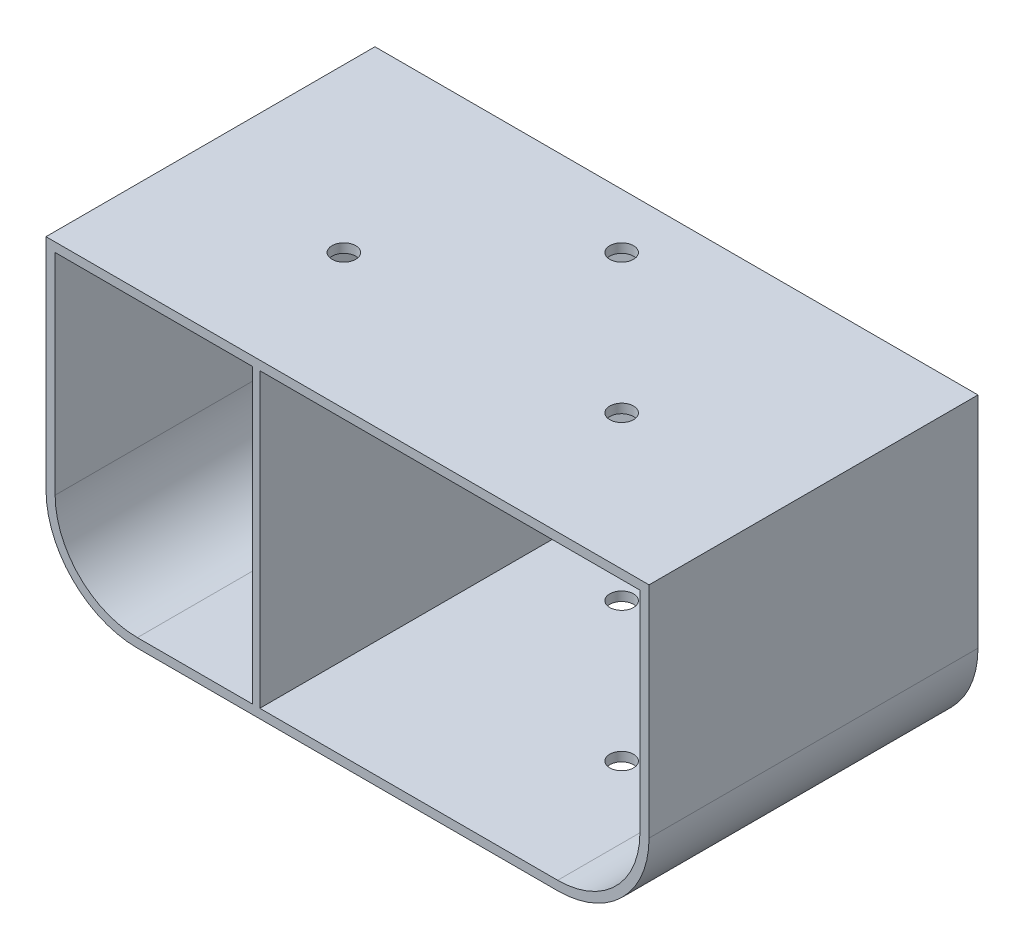
ISO-10303-21;
HEADER;
FILE_DESCRIPTION(('STEP AP214'),'2;1');
FILE_NAME('part.step','',(''),(''),'','','');
FILE_SCHEMA(('AUTOMOTIVE_DESIGN { 1 0 10303 214 1 1 1 1 }'));
ENDSEC;
DATA;
#1=APPLICATION_CONTEXT('core data for automotive mechanical design processes');
#2=APPLICATION_PROTOCOL_DEFINITION('international standard','automotive_design',2000,#1);
#3=PRODUCT_CONTEXT('',#1,'mechanical');
#4=PRODUCT('Part','Part','',(#3));
#5=PRODUCT_RELATED_PRODUCT_CATEGORY('part','',(#4));
#6=PRODUCT_DEFINITION_FORMATION('','',#4);
#7=PRODUCT_DEFINITION_CONTEXT('part definition',#1,'design');
#8=PRODUCT_DEFINITION('design','',#6,#7);
#9=PRODUCT_DEFINITION_SHAPE('','',#8);
#10=(LENGTH_UNIT() NAMED_UNIT(*) SI_UNIT(.MILLI.,.METRE.));
#11=(NAMED_UNIT(*) PLANE_ANGLE_UNIT() SI_UNIT($,.RADIAN.));
#12=(NAMED_UNIT(*) SI_UNIT($,.STERADIAN.) SOLID_ANGLE_UNIT());
#13=UNCERTAINTY_MEASURE_WITH_UNIT(LENGTH_MEASURE(1.E-05),#10,'distance_accuracy_value','');
#14=(GEOMETRIC_REPRESENTATION_CONTEXT(3) GLOBAL_UNCERTAINTY_ASSIGNED_CONTEXT((#13)) GLOBAL_UNIT_ASSIGNED_CONTEXT((#10,
#11,#12)) REPRESENTATION_CONTEXT('',''));
#15=CARTESIAN_POINT('',(0.,0.,0.));
#16=DIRECTION('',(0.,0.,1.));
#17=DIRECTION('',(1.,0.,0.));
#18=AXIS2_PLACEMENT_3D('',#15,#16,#17);
#19=CARTESIAN_POINT('',(-82.5000000000001,42.5,90.));
#20=DIRECTION('',(1.,0.,0.));
#21=DIRECTION('',(0.,0.,-1.));
#22=AXIS2_PLACEMENT_3D('',#19,#20,#21);
#23=PLANE('',#22);
#24=DIRECTION('',(0.,-1.,0.));
#25=VECTOR('',#24,1.);
#26=CARTESIAN_POINT('',(-82.5000000000001,42.5,0.));
#27=LINE('',#26,#25);
#28=CARTESIAN_POINT('',(-82.5000000000001,42.5,0.));
#29=VERTEX_POINT('',#28);
#30=CARTESIAN_POINT('',(-82.5000000000001,-17.4999999999998,0.));
#31=VERTEX_POINT('',#30);
#32=EDGE_CURVE('E224',#29,#31,#27,.T.);
#33=ORIENTED_EDGE('',*,*,#32,.T.);
#34=DIRECTION('',(0.,0.,-1.));
#35=VECTOR('',#34,1.);
#36=CARTESIAN_POINT('',(-82.5000000000001,-17.4999999999998,90.));
#37=LINE('',#36,#35);
#38=CARTESIAN_POINT('',(-82.5000000000001,-17.4999999999998,90.));
#39=VERTEX_POINT('',#38);
#40=EDGE_CURVE('E11',#39,#31,#37,.T.);
#41=ORIENTED_EDGE('',*,*,#40,.F.);
#42=DIRECTION('',(0.,-1.,0.));
#43=VECTOR('',#42,1.);
#44=CARTESIAN_POINT('',(-82.5000000000001,42.5,90.));
#45=LINE('',#44,#43);
#46=CARTESIAN_POINT('',(-82.5000000000001,42.5,90.));
#47=VERTEX_POINT('',#46);
#48=EDGE_CURVE('E232',#47,#39,#45,.T.);
#49=ORIENTED_EDGE('',*,*,#48,.F.);
#50=DIRECTION('',(0.,0.,-1.));
#51=VECTOR('',#50,1.);
#52=CARTESIAN_POINT('',(-82.5000000000001,42.5,90.));
#53=LINE('',#52,#51);
#54=EDGE_CURVE('E246',#47,#29,#53,.T.);
#55=ORIENTED_EDGE('',*,*,#54,.T.);
#56=EDGE_LOOP('',(#33,#41,#49,#55));
#57=FACE_BOUND('',#56,.T.);
#58=ADVANCED_FACE('F33',(#57),#23,.F.);
#59=CARTESIAN_POINT('',(-57.5000000000001,-17.5,90.));
#60=DIRECTION('',(0.,0.,-1.));
#61=DIRECTION('',(-1.,0.,0.));
#62=AXIS2_PLACEMENT_3D('',#59,#60,#61);
#63=CYLINDRICAL_SURFACE('',#62,25.);
#64=CARTESIAN_POINT('',(-57.5000000000001,-17.5,0.));
#65=DIRECTION('',(0.,0.,1.));
#66=DIRECTION('',(1.,0.,0.));
#67=AXIS2_PLACEMENT_3D('',#64,#65,#66);
#68=CIRCLE('',#67,25.);
#69=CARTESIAN_POINT('',(-57.4999999999999,-42.5,0.));
#70=VERTEX_POINT('',#69);
#71=EDGE_CURVE('E249',#31,#70,#68,.T.);
#72=ORIENTED_EDGE('',*,*,#71,.T.);
#73=DIRECTION('',(0.,0.,-1.));
#74=VECTOR('',#73,1.);
#75=CARTESIAN_POINT('',(-57.4999999999999,-42.5,90.));
#76=LINE('',#75,#74);
#77=CARTESIAN_POINT('',(-57.4999999999999,-42.5,90.));
#78=VERTEX_POINT('',#77);
#79=EDGE_CURVE('E41',#78,#70,#76,.T.);
#80=ORIENTED_EDGE('',*,*,#79,.F.);
#81=CARTESIAN_POINT('',(-57.5000000000001,-17.5,90.));
#82=DIRECTION('',(0.,0.,1.));
#83=DIRECTION('',(1.,0.,0.));
#84=AXIS2_PLACEMENT_3D('',#81,#82,#83);
#85=CIRCLE('',#84,25.);
#86=EDGE_CURVE('E235',#39,#78,#85,.T.);
#87=ORIENTED_EDGE('',*,*,#86,.F.);
#88=ORIENTED_EDGE('',*,*,#40,.T.);
#89=EDGE_LOOP('',(#72,#80,#87,#88));
#90=FACE_BOUND('',#89,.T.);
#91=ADVANCED_FACE('F332',(#90),#63,.T.);
#92=CARTESIAN_POINT('',(-57.4999999999999,-42.5,90.));
#93=DIRECTION('',(0.,1.,0.));
#94=DIRECTION('',(0.,0.,1.));
#95=AXIS2_PLACEMENT_3D('',#92,#93,#94);
#96=PLANE('',#95);
#97=CARTESIAN_POINT('',(0.,-42.5,15.));
#98=DIRECTION('',(0.,1.,0.));
#99=DIRECTION('',(0.,0.,1.));
#100=AXIS2_PLACEMENT_3D('',#97,#98,#99);
#101=CIRCLE('',#100,3.24999999999998);
#102=CARTESIAN_POINT('',(0.,-42.5,18.25));
#103=VERTEX_POINT('',#102);
#104=EDGE_CURVE('E298',#103,#103,#101,.T.);
#105=ORIENTED_EDGE('',*,*,#104,.T.);
#106=EDGE_LOOP('',(#105));
#107=FACE_BOUND('',#106,.T.);
#108=CARTESIAN_POINT('',(38.,-42.5,53.));
#109=DIRECTION('',(0.,1.,0.));
#110=DIRECTION('',(0.,0.,1.));
#111=AXIS2_PLACEMENT_3D('',#108,#109,#110);
#112=CIRCLE('',#111,3.24999999999998);
#113=CARTESIAN_POINT('',(38.,-42.5,56.25));
#114=VERTEX_POINT('',#113);
#115=EDGE_CURVE('E289',#114,#114,#112,.T.);
#116=ORIENTED_EDGE('',*,*,#115,.T.);
#117=EDGE_LOOP('',(#116));
#118=FACE_BOUND('',#117,.T.);
#119=CARTESIAN_POINT('',(-38.,-42.5,53.));
#120=DIRECTION('',(0.,1.,0.));
#121=DIRECTION('',(0.,0.,1.));
#122=AXIS2_PLACEMENT_3D('',#119,#120,#121);
#123=CIRCLE('',#122,3.24999999999998);
#124=CARTESIAN_POINT('',(-38.,-42.5,56.25));
#125=VERTEX_POINT('',#124);
#126=EDGE_CURVE('E272',#125,#125,#123,.T.);
#127=ORIENTED_EDGE('',*,*,#126,.T.);
#128=EDGE_LOOP('',(#127));
#129=FACE_BOUND('',#128,.T.);
#130=DIRECTION('',(1.,0.,0.));
#131=VECTOR('',#130,1.);
#132=CARTESIAN_POINT('',(-57.4999999999999,-42.5,0.));
#133=LINE('',#132,#131);
#134=CARTESIAN_POINT('',(57.4999999999998,-42.5,0.));
#135=VERTEX_POINT('',#134);
#136=EDGE_CURVE('E251',#70,#135,#133,.T.);
#137=ORIENTED_EDGE('',*,*,#136,.T.);
#138=DIRECTION('',(0.,0.,-1.));
#139=VECTOR('',#138,1.);
#140=CARTESIAN_POINT('',(57.4999999999998,-42.5,90.));
#141=LINE('',#140,#139);
#142=CARTESIAN_POINT('',(57.4999999999998,-42.5,90.));
#143=VERTEX_POINT('',#142);
#144=EDGE_CURVE('E266',#143,#135,#141,.T.);
#145=ORIENTED_EDGE('',*,*,#144,.F.);
#146=DIRECTION('',(1.,0.,0.));
#147=VECTOR('',#146,1.);
#148=CARTESIAN_POINT('',(-57.4999999999999,-42.5,90.));
#149=LINE('',#148,#147);
#150=EDGE_CURVE('E238',#78,#143,#149,.T.);
#151=ORIENTED_EDGE('',*,*,#150,.F.);
#152=ORIENTED_EDGE('',*,*,#79,.T.);
#153=EDGE_LOOP('',(#137,#145,#151,#152));
#154=FACE_BOUND('',#153,.T.);
#155=ADVANCED_FACE('F343',(#107,#118,#129,#154),#96,.F.);
#156=CARTESIAN_POINT('',(57.5,-17.5,90.));
#157=DIRECTION('',(0.,0.,-1.));
#158=DIRECTION('',(-1.,0.,0.));
#159=AXIS2_PLACEMENT_3D('',#156,#157,#158);
#160=CYLINDRICAL_SURFACE('',#159,25.);
#161=CARTESIAN_POINT('',(57.5,-17.5,0.));
#162=DIRECTION('',(0.,0.,1.));
#163=DIRECTION('',(1.,0.,0.));
#164=AXIS2_PLACEMENT_3D('',#161,#162,#163);
#165=CIRCLE('',#164,25.);
#166=CARTESIAN_POINT('',(82.4999999999999,-17.4999999999998,0.));
#167=VERTEX_POINT('',#166);
#168=EDGE_CURVE('E253',#135,#167,#165,.T.);
#169=ORIENTED_EDGE('',*,*,#168,.T.);
#170=DIRECTION('',(0.,0.,-1.));
#171=VECTOR('',#170,1.);
#172=CARTESIAN_POINT('',(82.4999999999999,-17.4999999999998,90.));
#173=LINE('',#172,#171);
#174=CARTESIAN_POINT('',(82.4999999999999,-17.4999999999998,90.));
#175=VERTEX_POINT('',#174);
#176=EDGE_CURVE('E263',#175,#167,#173,.T.);
#177=ORIENTED_EDGE('',*,*,#176,.F.);
#178=CARTESIAN_POINT('',(57.5,-17.5,90.));
#179=DIRECTION('',(0.,0.,1.));
#180=DIRECTION('',(1.,0.,0.));
#181=AXIS2_PLACEMENT_3D('',#178,#179,#180);
#182=CIRCLE('',#181,25.);
#183=EDGE_CURVE('E240',#143,#175,#182,.T.);
#184=ORIENTED_EDGE('',*,*,#183,.F.);
#185=ORIENTED_EDGE('',*,*,#144,.T.);
#186=EDGE_LOOP('',(#169,#177,#184,#185));
#187=FACE_BOUND('',#186,.T.);
#188=ADVANCED_FACE('F340',(#187),#160,.T.);
#189=CARTESIAN_POINT('',(82.4999999999999,42.5,90.));
#190=DIRECTION('',(-1.,0.,0.));
#191=DIRECTION('',(0.,0.,1.));
#192=AXIS2_PLACEMENT_3D('',#189,#190,#191);
#193=PLANE('',#192);
#194=DIRECTION('',(0.,1.,0.));
#195=VECTOR('',#194,1.);
#196=CARTESIAN_POINT('',(82.4999999999999,42.5,0.));
#197=LINE('',#196,#195);
#198=CARTESIAN_POINT('',(82.4999999999999,42.5,0.));
#199=VERTEX_POINT('',#198);
#200=EDGE_CURVE('E255',#167,#199,#197,.T.);
#201=ORIENTED_EDGE('',*,*,#200,.T.);
#202=DIRECTION('',(0.,0.,-1.));
#203=VECTOR('',#202,1.);
#204=CARTESIAN_POINT('',(82.4999999999999,42.5,90.));
#205=LINE('',#204,#203);
#206=CARTESIAN_POINT('',(82.4999999999999,42.5,90.));
#207=VERTEX_POINT('',#206);
#208=EDGE_CURVE('E260',#207,#199,#205,.T.);
#209=ORIENTED_EDGE('',*,*,#208,.F.);
#210=DIRECTION('',(0.,1.,0.));
#211=VECTOR('',#210,1.);
#212=CARTESIAN_POINT('',(82.4999999999999,42.5,90.));
#213=LINE('',#212,#211);
#214=EDGE_CURVE('E242',#175,#207,#213,.T.);
#215=ORIENTED_EDGE('',*,*,#214,.F.);
#216=ORIENTED_EDGE('',*,*,#176,.T.);
#217=EDGE_LOOP('',(#201,#209,#215,#216));
#218=FACE_BOUND('',#217,.T.);
#219=ADVANCED_FACE('F311',(#218),#193,.F.);
#220=CARTESIAN_POINT('',(-82.5000000000001,42.5,90.));
#221=DIRECTION('',(0.,-1.,0.));
#222=DIRECTION('',(0.,0.,-1.));
#223=AXIS2_PLACEMENT_3D('',#220,#221,#222);
#224=PLANE('',#223);
#225=CARTESIAN_POINT('',(0.,42.5,15.));
#226=DIRECTION('',(0.,1.,0.));
#227=DIRECTION('',(0.,0.,1.));
#228=AXIS2_PLACEMENT_3D('',#225,#226,#227);
#229=CIRCLE('',#228,3.24999999999999);
#230=CARTESIAN_POINT('',(0.,42.5,18.25));
#231=VERTEX_POINT('',#230);
#232=EDGE_CURVE('E301',#231,#231,#229,.T.);
#233=ORIENTED_EDGE('',*,*,#232,.F.);
#234=EDGE_LOOP('',(#233));
#235=FACE_BOUND('',#234,.T.);
#236=CARTESIAN_POINT('',(38.,42.5,53.));
#237=DIRECTION('',(0.,1.,0.));
#238=DIRECTION('',(0.,0.,1.));
#239=AXIS2_PLACEMENT_3D('',#236,#237,#238);
#240=CIRCLE('',#239,3.24999999999999);
#241=CARTESIAN_POINT('',(38.,42.5,56.25));
#242=VERTEX_POINT('',#241);
#243=EDGE_CURVE('E292',#242,#242,#240,.T.);
#244=ORIENTED_EDGE('',*,*,#243,.F.);
#245=EDGE_LOOP('',(#244));
#246=FACE_BOUND('',#245,.T.);
#247=CARTESIAN_POINT('',(-38.,42.5,53.));
#248=DIRECTION('',(0.,1.,0.));
#249=DIRECTION('',(0.,0.,1.));
#250=AXIS2_PLACEMENT_3D('',#247,#248,#249);
#251=CIRCLE('',#250,3.24999999999999);
#252=CARTESIAN_POINT('',(-38.,42.5,56.25));
#253=VERTEX_POINT('',#252);
#254=EDGE_CURVE('E277',#253,#253,#251,.T.);
#255=ORIENTED_EDGE('',*,*,#254,.F.);
#256=EDGE_LOOP('',(#255));
#257=FACE_BOUND('',#256,.T.);
#258=DIRECTION('',(-1.,0.,0.));
#259=VECTOR('',#258,1.);
#260=CARTESIAN_POINT('',(-82.5000000000001,42.5,0.));
#261=LINE('',#260,#259);
#262=EDGE_CURVE('E236',#199,#29,#261,.T.);
#263=ORIENTED_EDGE('',*,*,#262,.T.);
#264=ORIENTED_EDGE('',*,*,#54,.F.);
#265=DIRECTION('',(-1.,0.,0.));
#266=VECTOR('',#265,1.);
#267=CARTESIAN_POINT('',(-82.5000000000001,42.5,90.));
#268=LINE('',#267,#266);
#269=EDGE_CURVE('E244',#207,#47,#268,.T.);
#270=ORIENTED_EDGE('',*,*,#269,.F.);
#271=ORIENTED_EDGE('',*,*,#208,.T.);
#272=EDGE_LOOP('',(#263,#264,#270,#271));
#273=FACE_BOUND('',#272,.T.);
#274=ADVANCED_FACE('F307',(#235,#246,#257,#273),#224,.F.);
#275=CARTESIAN_POINT('',(-57.5000000000001,-17.5,90.));
#276=DIRECTION('',(0.,0.,1.));
#277=DIRECTION('',(1.,0.,0.));
#278=AXIS2_PLACEMENT_3D('',#275,#276,#277);
#279=PLANE('',#278);
#280=DIRECTION('',(0.,-1.,0.));
#281=VECTOR('',#280,1.);
#282=CARTESIAN_POINT('',(-80.0000000000001,0.,90.));
#283=LINE('',#282,#281);
#284=CARTESIAN_POINT('',(-80.0000000000001,40.,90.));
#285=VERTEX_POINT('',#284);
#286=CARTESIAN_POINT('',(-80.0000000000001,-17.4999999999998,90.));
#287=VERTEX_POINT('',#286);
#288=EDGE_CURVE('E49',#285,#287,#283,.T.);
#289=ORIENTED_EDGE('',*,*,#288,.F.);
#290=DIRECTION('',(1.,0.,0.));
#291=VECTOR('',#290,1.);
#292=CARTESIAN_POINT('',(0.,40.,90.));
#293=LINE('',#292,#291);
#294=CARTESIAN_POINT('',(-26.0000000000001,40.,90.));
#295=VERTEX_POINT('',#294);
#296=EDGE_CURVE('E167',#285,#295,#293,.T.);
#297=ORIENTED_EDGE('',*,*,#296,.T.);
#298=DIRECTION('',(0.,1.,0.));
#299=VECTOR('',#298,1.);
#300=CARTESIAN_POINT('',(-26.0000000000001,0.,90.));
#301=LINE('',#300,#299);
#302=CARTESIAN_POINT('',(-26.0000000000001,-40.,90.));
#303=VERTEX_POINT('',#302);
#304=EDGE_CURVE('E170',#303,#295,#301,.T.);
#305=ORIENTED_EDGE('',*,*,#304,.F.);
#306=DIRECTION('',(1.,0.,0.));
#307=VECTOR('',#306,1.);
#308=CARTESIAN_POINT('',(0.,-40.,90.));
#309=LINE('',#308,#307);
#310=CARTESIAN_POINT('',(-57.4999999999999,-40.,90.));
#311=VERTEX_POINT('',#310);
#312=EDGE_CURVE('E183',#311,#303,#309,.T.);
#313=ORIENTED_EDGE('',*,*,#312,.F.);
#314=CARTESIAN_POINT('',(-57.5000000000001,-17.5,90.));
#315=DIRECTION('',(0.,0.,1.));
#316=DIRECTION('',(1.,0.,0.));
#317=AXIS2_PLACEMENT_3D('',#314,#315,#316);
#318=CIRCLE('',#317,22.5);
#319=EDGE_CURVE('E181',#287,#311,#318,.T.);
#320=ORIENTED_EDGE('',*,*,#319,.F.);
#321=EDGE_LOOP('',(#289,#297,#305,#313,#320));
#322=FACE_BOUND('',#321,.T.);
#323=DIRECTION('',(1.,0.,0.));
#324=VECTOR('',#323,1.);
#325=CARTESIAN_POINT('',(0.,-40.,90.));
#326=LINE('',#325,#324);
#327=CARTESIAN_POINT('',(-24.,-40.,90.));
#328=VERTEX_POINT('',#327);
#329=CARTESIAN_POINT('',(57.4999999999998,-40.,90.));
#330=VERTEX_POINT('',#329);
#331=EDGE_CURVE('E57',#328,#330,#326,.T.);
#332=ORIENTED_EDGE('',*,*,#331,.F.);
#333=DIRECTION('',(0.,-1.,0.));
#334=VECTOR('',#333,1.);
#335=CARTESIAN_POINT('',(-24.,0.,90.));
#336=LINE('',#335,#334);
#337=CARTESIAN_POINT('',(-24.,40.,90.));
#338=VERTEX_POINT('',#337);
#339=EDGE_CURVE('E199',#338,#328,#336,.T.);
#340=ORIENTED_EDGE('',*,*,#339,.F.);
#341=DIRECTION('',(1.,0.,0.));
#342=VECTOR('',#341,1.);
#343=CARTESIAN_POINT('',(0.,40.,90.));
#344=LINE('',#343,#342);
#345=CARTESIAN_POINT('',(79.9999999999999,40.,90.));
#346=VERTEX_POINT('',#345);
#347=EDGE_CURVE('E217',#338,#346,#344,.T.);
#348=ORIENTED_EDGE('',*,*,#347,.T.);
#349=DIRECTION('',(0.,-1.,0.));
#350=VECTOR('',#349,1.);
#351=CARTESIAN_POINT('',(79.9999999999999,0.,90.));
#352=LINE('',#351,#350);
#353=CARTESIAN_POINT('',(79.9999999999999,-17.4999999999998,90.));
#354=VERTEX_POINT('',#353);
#355=EDGE_CURVE('E214',#346,#354,#352,.T.);
#356=ORIENTED_EDGE('',*,*,#355,.T.);
#357=CARTESIAN_POINT('',(57.5,-17.5,90.));
#358=DIRECTION('',(0.,0.,1.));
#359=DIRECTION('',(1.,0.,0.));
#360=AXIS2_PLACEMENT_3D('',#357,#358,#359);
#361=CIRCLE('',#360,22.5);
#362=EDGE_CURVE('E211',#330,#354,#361,.T.);
#363=ORIENTED_EDGE('',*,*,#362,.F.);
#364=EDGE_LOOP('',(#332,#340,#348,#356,#363));
#365=FACE_BOUND('',#364,.T.);
#366=ORIENTED_EDGE('',*,*,#48,.T.);
#367=ORIENTED_EDGE('',*,*,#86,.T.);
#368=ORIENTED_EDGE('',*,*,#150,.T.);
#369=ORIENTED_EDGE('',*,*,#183,.T.);
#370=ORIENTED_EDGE('',*,*,#214,.T.);
#371=ORIENTED_EDGE('',*,*,#269,.T.);
#372=EDGE_LOOP('',(#366,#367,#368,#369,#370,#371));
#373=FACE_BOUND('',#372,.T.);
#374=ADVANCED_FACE('F310',(#322,#365,#373),#279,.T.);
#375=CARTESIAN_POINT('',(-57.5000000000001,-17.5,0.));
#376=DIRECTION('',(0.,0.,1.));
#377=DIRECTION('',(1.,0.,0.));
#378=AXIS2_PLACEMENT_3D('',#375,#376,#377);
#379=PLANE('',#378);
#380=ORIENTED_EDGE('',*,*,#32,.F.);
#381=ORIENTED_EDGE('',*,*,#262,.F.);
#382=ORIENTED_EDGE('',*,*,#200,.F.);
#383=ORIENTED_EDGE('',*,*,#168,.F.);
#384=ORIENTED_EDGE('',*,*,#136,.F.);
#385=ORIENTED_EDGE('',*,*,#71,.F.);
#386=EDGE_LOOP('',(#380,#381,#382,#383,#384,#385));
#387=FACE_BOUND('',#386,.T.);
#388=ADVANCED_FACE('F327',(#387),#379,.F.);
#389=CARTESIAN_POINT('',(0.,-40.,3.));
#390=DIRECTION('',(0.,-1.,0.));
#391=DIRECTION('',(1.,0.,0.));
#392=AXIS2_PLACEMENT_3D('',#389,#390,#391);
#393=PLANE('',#392);
#394=CARTESIAN_POINT('',(0.,-40.,15.));
#395=DIRECTION('',(0.,-1.,0.));
#396=DIRECTION('',(1.,0.,0.));
#397=AXIS2_PLACEMENT_3D('',#394,#395,#396);
#398=CIRCLE('',#397,3.24999999999998);
#399=CARTESIAN_POINT('',(3.24999999999999,-40.,15.));
#400=VERTEX_POINT('',#399);
#401=EDGE_CURVE('E295',#400,#400,#398,.T.);
#402=ORIENTED_EDGE('',*,*,#401,.T.);
#403=EDGE_LOOP('',(#402));
#404=FACE_BOUND('',#403,.T.);
#405=CARTESIAN_POINT('',(38.,-40.,53.));
#406=DIRECTION('',(0.,-1.,0.));
#407=DIRECTION('',(1.,0.,0.));
#408=AXIS2_PLACEMENT_3D('',#405,#406,#407);
#409=CIRCLE('',#408,3.24999999999999);
#410=CARTESIAN_POINT('',(41.25,-40.,53.));
#411=VERTEX_POINT('',#410);
#412=EDGE_CURVE('E281',#411,#411,#409,.T.);
#413=ORIENTED_EDGE('',*,*,#412,.T.);
#414=EDGE_LOOP('',(#413));
#415=FACE_BOUND('',#414,.T.);
#416=ORIENTED_EDGE('',*,*,#331,.T.);
#417=DIRECTION('',(0.,0.,1.));
#418=VECTOR('',#417,1.);
#419=CARTESIAN_POINT('',(57.4999999999998,-40.,3.));
#420=LINE('',#419,#418);
#421=CARTESIAN_POINT('',(57.4999999999998,-40.,3.));
#422=VERTEX_POINT('',#421);
#423=EDGE_CURVE('E209',#422,#330,#420,.T.);
#424=ORIENTED_EDGE('',*,*,#423,.F.);
#425=DIRECTION('',(1.,0.,0.));
#426=VECTOR('',#425,1.);
#427=CARTESIAN_POINT('',(0.,-40.,3.));
#428=LINE('',#427,#426);
#429=CARTESIAN_POINT('',(-24.,-40.,3.));
#430=VERTEX_POINT('',#429);
#431=EDGE_CURVE('E195',#430,#422,#428,.T.);
#432=ORIENTED_EDGE('',*,*,#431,.F.);
#433=DIRECTION('',(0.,0.,1.));
#434=VECTOR('',#433,1.);
#435=CARTESIAN_POINT('',(-24.,-40.,3.));
#436=LINE('',#435,#434);
#437=EDGE_CURVE('E222',#430,#328,#436,.T.);
#438=ORIENTED_EDGE('',*,*,#437,.T.);
#439=EDGE_LOOP('',(#416,#424,#432,#438));
#440=FACE_BOUND('',#439,.T.);
#441=ADVANCED_FACE('F399',(#404,#415,#440),#393,.F.);
#442=CARTESIAN_POINT('',(-24.,0.,3.));
#443=DIRECTION('',(-1.,0.,0.));
#444=DIRECTION('',(0.,-1.,0.));
#445=AXIS2_PLACEMENT_3D('',#442,#443,#444);
#446=PLANE('',#445);
#447=ORIENTED_EDGE('',*,*,#339,.T.);
#448=ORIENTED_EDGE('',*,*,#437,.F.);
#449=DIRECTION('',(0.,-1.,0.));
#450=VECTOR('',#449,1.);
#451=CARTESIAN_POINT('',(-24.,0.,3.));
#452=LINE('',#451,#450);
#453=CARTESIAN_POINT('',(-24.,40.,3.));
#454=VERTEX_POINT('',#453);
#455=EDGE_CURVE('E206',#454,#430,#452,.T.);
#456=ORIENTED_EDGE('',*,*,#455,.F.);
#457=DIRECTION('',(0.,0.,1.));
#458=VECTOR('',#457,1.);
#459=CARTESIAN_POINT('',(-24.,40.,3.));
#460=LINE('',#459,#458);
#461=EDGE_CURVE('E225',#454,#338,#460,.T.);
#462=ORIENTED_EDGE('',*,*,#461,.T.);
#463=EDGE_LOOP('',(#447,#448,#456,#462));
#464=FACE_BOUND('',#463,.T.);
#465=ADVANCED_FACE('F405',(#464),#446,.F.);
#466=CARTESIAN_POINT('',(0.,40.,3.));
#467=DIRECTION('',(0.,-1.,0.));
#468=DIRECTION('',(0.,0.,-1.));
#469=AXIS2_PLACEMENT_3D('',#466,#467,#468);
#470=PLANE('',#469);
#471=CARTESIAN_POINT('',(0.,40.,15.));
#472=DIRECTION('',(0.,-1.,0.));
#473=DIRECTION('',(0.,0.,-1.));
#474=AXIS2_PLACEMENT_3D('',#471,#472,#473);
#475=CIRCLE('',#474,3.24999999999998);
#476=CARTESIAN_POINT('',(0.,40.,11.75));
#477=VERTEX_POINT('',#476);
#478=EDGE_CURVE('E36',#477,#477,#475,.T.);
#479=ORIENTED_EDGE('',*,*,#478,.F.);
#480=EDGE_LOOP('',(#479));
#481=FACE_BOUND('',#480,.T.);
#482=CARTESIAN_POINT('',(38.,40.,53.));
#483=DIRECTION('',(0.,-1.,0.));
#484=DIRECTION('',(0.,0.,-1.));
#485=AXIS2_PLACEMENT_3D('',#482,#483,#484);
#486=CIRCLE('',#485,3.24999999999999);
#487=CARTESIAN_POINT('',(38.,40.,49.75));
#488=VERTEX_POINT('',#487);
#489=EDGE_CURVE('E286',#488,#488,#486,.T.);
#490=ORIENTED_EDGE('',*,*,#489,.F.);
#491=EDGE_LOOP('',(#490));
#492=FACE_BOUND('',#491,.T.);
#493=ORIENTED_EDGE('',*,*,#347,.F.);
#494=ORIENTED_EDGE('',*,*,#461,.F.);
#495=DIRECTION('',(1.,0.,0.));
#496=VECTOR('',#495,1.);
#497=CARTESIAN_POINT('',(0.,40.,3.));
#498=LINE('',#497,#496);
#499=CARTESIAN_POINT('',(79.9999999999999,40.,3.));
#500=VERTEX_POINT('',#499);
#501=EDGE_CURVE('E204',#454,#500,#498,.T.);
#502=ORIENTED_EDGE('',*,*,#501,.T.);
#503=DIRECTION('',(0.,0.,1.));
#504=VECTOR('',#503,1.);
#505=CARTESIAN_POINT('',(79.9999999999999,40.,3.));
#506=LINE('',#505,#504);
#507=EDGE_CURVE('E227',#500,#346,#506,.T.);
#508=ORIENTED_EDGE('',*,*,#507,.T.);
#509=EDGE_LOOP('',(#493,#494,#502,#508));
#510=FACE_BOUND('',#509,.T.);
#511=ADVANCED_FACE('F415',(#481,#492,#510),#470,.T.);
#512=CARTESIAN_POINT('',(79.9999999999999,0.,3.));
#513=DIRECTION('',(-1.,0.,0.));
#514=DIRECTION('',(0.,0.,1.));
#515=AXIS2_PLACEMENT_3D('',#512,#513,#514);
#516=PLANE('',#515);
#517=ORIENTED_EDGE('',*,*,#355,.F.);
#518=ORIENTED_EDGE('',*,*,#507,.F.);
#519=DIRECTION('',(0.,-1.,0.));
#520=VECTOR('',#519,1.);
#521=CARTESIAN_POINT('',(79.9999999999999,0.,3.));
#522=LINE('',#521,#520);
#523=CARTESIAN_POINT('',(79.9999999999999,-17.4999999999998,3.));
#524=VERTEX_POINT('',#523);
#525=EDGE_CURVE('E202',#500,#524,#522,.T.);
#526=ORIENTED_EDGE('',*,*,#525,.T.);
#527=DIRECTION('',(0.,0.,1.));
#528=VECTOR('',#527,1.);
#529=CARTESIAN_POINT('',(79.9999999999999,-17.4999999999998,3.));
#530=LINE('',#529,#528);
#531=EDGE_CURVE('E229',#524,#354,#530,.T.);
#532=ORIENTED_EDGE('',*,*,#531,.T.);
#533=EDGE_LOOP('',(#517,#518,#526,#532));
#534=FACE_BOUND('',#533,.T.);
#535=ADVANCED_FACE('F423',(#534),#516,.T.);
#536=CARTESIAN_POINT('',(57.5,-17.5,3.));
#537=DIRECTION('',(0.,0.,1.));
#538=DIRECTION('',(1.,0.,0.));
#539=AXIS2_PLACEMENT_3D('',#536,#537,#538);
#540=CYLINDRICAL_SURFACE('',#539,22.5);
#541=ORIENTED_EDGE('',*,*,#362,.T.);
#542=ORIENTED_EDGE('',*,*,#531,.F.);
#543=CARTESIAN_POINT('',(57.5,-17.5,3.));
#544=DIRECTION('',(0.,0.,1.));
#545=DIRECTION('',(1.,0.,0.));
#546=AXIS2_PLACEMENT_3D('',#543,#544,#545);
#547=CIRCLE('',#546,22.5);
#548=EDGE_CURVE('E198',#422,#524,#547,.T.);
#549=ORIENTED_EDGE('',*,*,#548,.F.);
#550=ORIENTED_EDGE('',*,*,#423,.T.);
#551=EDGE_LOOP('',(#541,#542,#549,#550));
#552=FACE_BOUND('',#551,.T.);
#553=ADVANCED_FACE('F433',(#552),#540,.F.);
#554=CARTESIAN_POINT('',(0.,0.,3.));
#555=DIRECTION('',(0.,0.,1.));
#556=DIRECTION('',(1.,0.,0.));
#557=AXIS2_PLACEMENT_3D('',#554,#555,#556);
#558=PLANE('',#557);
#559=ORIENTED_EDGE('',*,*,#431,.T.);
#560=ORIENTED_EDGE('',*,*,#548,.T.);
#561=ORIENTED_EDGE('',*,*,#525,.F.);
#562=ORIENTED_EDGE('',*,*,#501,.F.);
#563=ORIENTED_EDGE('',*,*,#455,.T.);
#564=EDGE_LOOP('',(#559,#560,#561,#562,#563));
#565=FACE_BOUND('',#564,.T.);
#566=ADVANCED_FACE('F440',(#565),#558,.T.);
#567=CARTESIAN_POINT('',(-80.0000000000001,0.,3.));
#568=DIRECTION('',(-1.,0.,0.));
#569=DIRECTION('',(0.,0.,1.));
#570=AXIS2_PLACEMENT_3D('',#567,#568,#569);
#571=PLANE('',#570);
#572=ORIENTED_EDGE('',*,*,#288,.T.);
#573=DIRECTION('',(0.,0.,1.));
#574=VECTOR('',#573,1.);
#575=CARTESIAN_POINT('',(-80.0000000000001,-17.4999999999998,3.));
#576=LINE('',#575,#574);
#577=CARTESIAN_POINT('',(-80.0000000000001,-17.4999999999998,3.));
#578=VERTEX_POINT('',#577);
#579=EDGE_CURVE('E145',#578,#287,#576,.T.);
#580=ORIENTED_EDGE('',*,*,#579,.F.);
#581=DIRECTION('',(0.,-1.,0.));
#582=VECTOR('',#581,1.);
#583=CARTESIAN_POINT('',(-80.0000000000001,0.,3.));
#584=LINE('',#583,#582);
#585=CARTESIAN_POINT('',(-80.0000000000001,40.,3.));
#586=VERTEX_POINT('',#585);
#587=EDGE_CURVE('E149',#586,#578,#584,.T.);
#588=ORIENTED_EDGE('',*,*,#587,.F.);
#589=DIRECTION('',(0.,0.,1.));
#590=VECTOR('',#589,1.);
#591=CARTESIAN_POINT('',(-80.0000000000001,40.,3.));
#592=LINE('',#591,#590);
#593=EDGE_CURVE('E188',#586,#285,#592,.T.);
#594=ORIENTED_EDGE('',*,*,#593,.T.);
#595=EDGE_LOOP('',(#572,#580,#588,#594));
#596=FACE_BOUND('',#595,.T.);
#597=ADVANCED_FACE('F147',(#596),#571,.F.);
#598=CARTESIAN_POINT('',(0.,40.,3.));
#599=DIRECTION('',(0.,-1.,0.));
#600=DIRECTION('',(0.,0.,-1.));
#601=AXIS2_PLACEMENT_3D('',#598,#599,#600);
#602=PLANE('',#601);
#603=CARTESIAN_POINT('',(-38.,40.,53.));
#604=DIRECTION('',(0.,-1.,0.));
#605=DIRECTION('',(0.,0.,-1.));
#606=AXIS2_PLACEMENT_3D('',#603,#604,#605);
#607=CIRCLE('',#606,3.24999999999999);
#608=CARTESIAN_POINT('',(-38.,40.,49.75));
#609=VERTEX_POINT('',#608);
#610=EDGE_CURVE('E173',#609,#609,#607,.T.);
#611=ORIENTED_EDGE('',*,*,#610,.F.);
#612=EDGE_LOOP('',(#611));
#613=FACE_BOUND('',#612,.T.);
#614=ORIENTED_EDGE('',*,*,#296,.F.);
#615=ORIENTED_EDGE('',*,*,#593,.F.);
#616=DIRECTION('',(1.,0.,0.));
#617=VECTOR('',#616,1.);
#618=CARTESIAN_POINT('',(0.,40.,3.));
#619=LINE('',#618,#617);
#620=CARTESIAN_POINT('',(-26.0000000000001,40.,3.));
#621=VERTEX_POINT('',#620);
#622=EDGE_CURVE('E154',#586,#621,#619,.T.);
#623=ORIENTED_EDGE('',*,*,#622,.T.);
#624=DIRECTION('',(0.,0.,1.));
#625=VECTOR('',#624,1.);
#626=CARTESIAN_POINT('',(-26.0000000000001,40.,3.));
#627=LINE('',#626,#625);
#628=EDGE_CURVE('E190',#621,#295,#627,.T.);
#629=ORIENTED_EDGE('',*,*,#628,.T.);
#630=EDGE_LOOP('',(#614,#615,#623,#629));
#631=FACE_BOUND('',#630,.T.);
#632=ADVANCED_FACE('F455',(#613,#631),#602,.T.);
#633=CARTESIAN_POINT('',(-26.0000000000001,0.,3.));
#634=DIRECTION('',(1.,0.,0.));
#635=DIRECTION('',(0.,0.,-1.));
#636=AXIS2_PLACEMENT_3D('',#633,#634,#635);
#637=PLANE('',#636);
#638=ORIENTED_EDGE('',*,*,#304,.T.);
#639=ORIENTED_EDGE('',*,*,#628,.F.);
#640=DIRECTION('',(0.,1.,0.));
#641=VECTOR('',#640,1.);
#642=CARTESIAN_POINT('',(-26.0000000000001,0.,3.));
#643=LINE('',#642,#641);
#644=CARTESIAN_POINT('',(-26.0000000000001,-40.,3.));
#645=VERTEX_POINT('',#644);
#646=EDGE_CURVE('E177',#645,#621,#643,.T.);
#647=ORIENTED_EDGE('',*,*,#646,.F.);
#648=DIRECTION('',(0.,0.,1.));
#649=VECTOR('',#648,1.);
#650=CARTESIAN_POINT('',(-26.0000000000001,-40.,3.));
#651=LINE('',#650,#649);
#652=EDGE_CURVE('E192',#645,#303,#651,.T.);
#653=ORIENTED_EDGE('',*,*,#652,.T.);
#654=EDGE_LOOP('',(#638,#639,#647,#653));
#655=FACE_BOUND('',#654,.T.);
#656=ADVANCED_FACE('F463',(#655),#637,.F.);
#657=CARTESIAN_POINT('',(0.,-40.,3.));
#658=DIRECTION('',(0.,-1.,0.));
#659=DIRECTION('',(1.,0.,0.));
#660=AXIS2_PLACEMENT_3D('',#657,#658,#659);
#661=PLANE('',#660);
#662=CARTESIAN_POINT('',(-38.,-40.,53.));
#663=DIRECTION('',(0.,-1.,0.));
#664=DIRECTION('',(1.,0.,0.));
#665=AXIS2_PLACEMENT_3D('',#662,#663,#664);
#666=CIRCLE('',#665,3.24999999999999);
#667=CARTESIAN_POINT('',(-34.75,-40.,53.));
#668=VERTEX_POINT('',#667);
#669=EDGE_CURVE('E270',#668,#668,#666,.T.);
#670=ORIENTED_EDGE('',*,*,#669,.T.);
#671=EDGE_LOOP('',(#670));
#672=FACE_BOUND('',#671,.T.);
#673=ORIENTED_EDGE('',*,*,#312,.T.);
#674=ORIENTED_EDGE('',*,*,#652,.F.);
#675=DIRECTION('',(1.,0.,0.));
#676=VECTOR('',#675,1.);
#677=CARTESIAN_POINT('',(0.,-40.,3.));
#678=LINE('',#677,#676);
#679=CARTESIAN_POINT('',(-57.4999999999999,-40.,3.));
#680=VERTEX_POINT('',#679);
#681=EDGE_CURVE('E162',#680,#645,#678,.T.);
#682=ORIENTED_EDGE('',*,*,#681,.F.);
#683=DIRECTION('',(0.,0.,1.));
#684=VECTOR('',#683,1.);
#685=CARTESIAN_POINT('',(-57.4999999999999,-40.,3.));
#686=LINE('',#685,#684);
#687=EDGE_CURVE('E153',#680,#311,#686,.T.);
#688=ORIENTED_EDGE('',*,*,#687,.T.);
#689=EDGE_LOOP('',(#673,#674,#682,#688));
#690=FACE_BOUND('',#689,.T.);
#691=ADVANCED_FACE('F473',(#672,#690),#661,.F.);
#692=CARTESIAN_POINT('',(-57.5000000000001,-17.5,3.));
#693=DIRECTION('',(0.,0.,1.));
#694=DIRECTION('',(1.,0.,0.));
#695=AXIS2_PLACEMENT_3D('',#692,#693,#694);
#696=CYLINDRICAL_SURFACE('',#695,22.5);
#697=ORIENTED_EDGE('',*,*,#319,.T.);
#698=ORIENTED_EDGE('',*,*,#687,.F.);
#699=CARTESIAN_POINT('',(-57.5000000000001,-17.5,3.));
#700=DIRECTION('',(0.,0.,1.));
#701=DIRECTION('',(1.,0.,0.));
#702=AXIS2_PLACEMENT_3D('',#699,#700,#701);
#703=CIRCLE('',#702,22.5);
#704=EDGE_CURVE('E157',#578,#680,#703,.T.);
#705=ORIENTED_EDGE('',*,*,#704,.F.);
#706=ORIENTED_EDGE('',*,*,#579,.T.);
#707=EDGE_LOOP('',(#697,#698,#705,#706));
#708=FACE_BOUND('',#707,.T.);
#709=ADVANCED_FACE('F158',(#708),#696,.F.);
#710=CARTESIAN_POINT('',(0.,0.,3.));
#711=DIRECTION('',(0.,0.,1.));
#712=DIRECTION('',(1.,0.,0.));
#713=AXIS2_PLACEMENT_3D('',#710,#711,#712);
#714=PLANE('',#713);
#715=ORIENTED_EDGE('',*,*,#587,.T.);
#716=ORIENTED_EDGE('',*,*,#704,.T.);
#717=ORIENTED_EDGE('',*,*,#681,.T.);
#718=ORIENTED_EDGE('',*,*,#646,.T.);
#719=ORIENTED_EDGE('',*,*,#622,.F.);
#720=EDGE_LOOP('',(#715,#716,#717,#718,#719));
#721=FACE_BOUND('',#720,.T.);
#722=ADVANCED_FACE('F165',(#721),#714,.T.);
#723=CARTESIAN_POINT('',(-38.,42.5,53.));
#724=DIRECTION('',(0.,1.,0.));
#725=DIRECTION('',(0.,0.,1.));
#726=AXIS2_PLACEMENT_3D('',#723,#724,#725);
#727=CYLINDRICAL_SURFACE('',#726,3.24999999999999);
#728=ORIENTED_EDGE('',*,*,#126,.F.);
#729=EDGE_LOOP('',(#728));
#730=FACE_BOUND('',#729,.T.);
#731=ORIENTED_EDGE('',*,*,#669,.F.);
#732=EDGE_LOOP('',(#731));
#733=FACE_BOUND('',#732,.T.);
#734=ADVANCED_FACE('F493',(#730,#733),#727,.F.);
#735=ORIENTED_EDGE('',*,*,#610,.T.);
#736=EDGE_LOOP('',(#735));
#737=FACE_BOUND('',#736,.T.);
#738=ORIENTED_EDGE('',*,*,#254,.T.);
#739=EDGE_LOOP('',(#738));
#740=FACE_BOUND('',#739,.T.);
#741=ADVANCED_FACE('F499',(#737,#740),#727,.F.);
#742=CARTESIAN_POINT('',(38.,42.5,53.));
#743=DIRECTION('',(0.,1.,0.));
#744=DIRECTION('',(0.,0.,1.));
#745=AXIS2_PLACEMENT_3D('',#742,#743,#744);
#746=CYLINDRICAL_SURFACE('',#745,3.24999999999999);
#747=ORIENTED_EDGE('',*,*,#115,.F.);
#748=EDGE_LOOP('',(#747));
#749=FACE_BOUND('',#748,.T.);
#750=ORIENTED_EDGE('',*,*,#412,.F.);
#751=EDGE_LOOP('',(#750));
#752=FACE_BOUND('',#751,.T.);
#753=ADVANCED_FACE('F507',(#749,#752),#746,.F.);
#754=ORIENTED_EDGE('',*,*,#489,.T.);
#755=EDGE_LOOP('',(#754));
#756=FACE_BOUND('',#755,.T.);
#757=ORIENTED_EDGE('',*,*,#243,.T.);
#758=EDGE_LOOP('',(#757));
#759=FACE_BOUND('',#758,.T.);
#760=ADVANCED_FACE('F514',(#756,#759),#746,.F.);
#761=CARTESIAN_POINT('',(0.,42.5,15.));
#762=DIRECTION('',(0.,1.,0.));
#763=DIRECTION('',(0.,0.,1.));
#764=AXIS2_PLACEMENT_3D('',#761,#762,#763);
#765=CYLINDRICAL_SURFACE('',#764,3.24999999999998);
#766=ORIENTED_EDGE('',*,*,#478,.T.);
#767=EDGE_LOOP('',(#766));
#768=FACE_BOUND('',#767,.T.);
#769=ORIENTED_EDGE('',*,*,#232,.T.);
#770=EDGE_LOOP('',(#769));
#771=FACE_BOUND('',#770,.T.);
#772=ADVANCED_FACE('F305',(#768,#771),#765,.F.);
#773=ORIENTED_EDGE('',*,*,#104,.F.);
#774=EDGE_LOOP('',(#773));
#775=FACE_BOUND('',#774,.T.);
#776=ORIENTED_EDGE('',*,*,#401,.F.);
#777=EDGE_LOOP('',(#776));
#778=FACE_BOUND('',#777,.T.);
#779=ADVANCED_FACE('F528',(#775,#778),#765,.F.);
#780=CLOSED_SHELL('',(#58,#91,#155,#188,#219,#274,#374,#388,#441,#465,#511,#535,#553,#566,#597,
#632,#656,#691,#709,#722,#734,#741,#753,#760,#772,#779));
#781=MANIFOLD_SOLID_BREP('B2',#780);
#782=ADVANCED_BREP_SHAPE_REPRESENTATION('',(#18,#781),#14);
#783=SHAPE_DEFINITION_REPRESENTATION(#9,#782);
ENDSEC;
END-ISO-10303-21;
